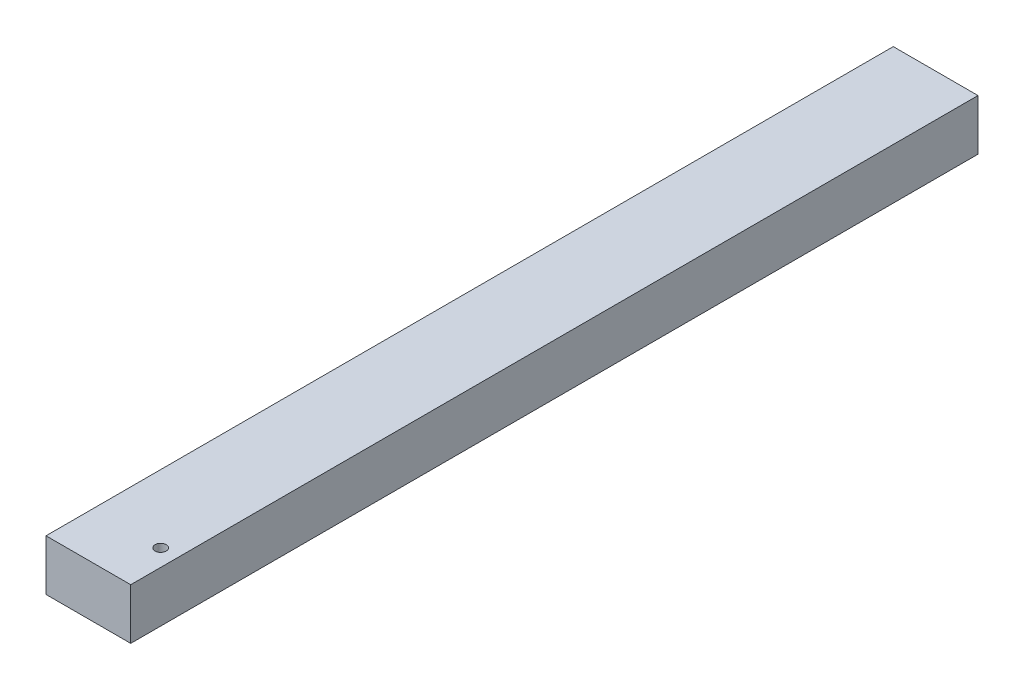
ISO-10303-21;
HEADER;
FILE_DESCRIPTION(('STEP AP214'),'2;1');
FILE_NAME('part.step','',(''),(''),'','','');
FILE_SCHEMA(('AUTOMOTIVE_DESIGN { 1 0 10303 214 1 1 1 1 }'));
ENDSEC;
DATA;
#1=APPLICATION_CONTEXT('core data for automotive mechanical design processes');
#2=APPLICATION_PROTOCOL_DEFINITION('international standard','automotive_design',2000,#1);
#3=PRODUCT_CONTEXT('',#1,'mechanical');
#4=PRODUCT('Part','Part','',(#3));
#5=PRODUCT_RELATED_PRODUCT_CATEGORY('part','',(#4));
#6=PRODUCT_DEFINITION_FORMATION('','',#4);
#7=PRODUCT_DEFINITION_CONTEXT('part definition',#1,'design');
#8=PRODUCT_DEFINITION('design','',#6,#7);
#9=PRODUCT_DEFINITION_SHAPE('','',#8);
#10=(LENGTH_UNIT() NAMED_UNIT(*) SI_UNIT(.MILLI.,.METRE.));
#11=(NAMED_UNIT(*) PLANE_ANGLE_UNIT() SI_UNIT($,.RADIAN.));
#12=(NAMED_UNIT(*) SI_UNIT($,.STERADIAN.) SOLID_ANGLE_UNIT());
#13=UNCERTAINTY_MEASURE_WITH_UNIT(LENGTH_MEASURE(1.E-05),#10,'distance_accuracy_value','');
#14=(GEOMETRIC_REPRESENTATION_CONTEXT(3) GLOBAL_UNCERTAINTY_ASSIGNED_CONTEXT((#13)) GLOBAL_UNIT_ASSIGNED_CONTEXT((#10,
#11,#12)) REPRESENTATION_CONTEXT('',''));
#15=CARTESIAN_POINT('',(0.,0.,0.));
#16=DIRECTION('',(0.,0.,1.));
#17=DIRECTION('',(1.,0.,0.));
#18=AXIS2_PLACEMENT_3D('',#15,#16,#17);
#19=CARTESIAN_POINT('',(0.,0.,500.));
#20=DIRECTION('',(-1.,0.,0.));
#21=DIRECTION('',(0.,0.,1.));
#22=AXIS2_PLACEMENT_3D('',#19,#20,#21);
#23=PLANE('',#22);
#24=DIRECTION('',(0.,1.,0.));
#25=VECTOR('',#24,1.);
#26=CARTESIAN_POINT('',(0.,0.,0.));
#27=LINE('',#26,#25);
#28=CARTESIAN_POINT('',(0.,0.,0.));
#29=VERTEX_POINT('',#28);
#30=CARTESIAN_POINT('',(0.,30.,0.));
#31=VERTEX_POINT('',#30);
#32=EDGE_CURVE('E96',#29,#31,#27,.T.);
#33=ORIENTED_EDGE('',*,*,#32,.T.);
#34=DIRECTION('',(0.,0.,-1.));
#35=VECTOR('',#34,1.);
#36=CARTESIAN_POINT('',(0.,30.,500.));
#37=LINE('',#36,#35);
#38=CARTESIAN_POINT('',(0.,30.,500.));
#39=VERTEX_POINT('',#38);
#40=EDGE_CURVE('E11',#39,#31,#37,.T.);
#41=ORIENTED_EDGE('',*,*,#40,.F.);
#42=DIRECTION('',(0.,1.,0.));
#43=VECTOR('',#42,1.);
#44=CARTESIAN_POINT('',(0.,0.,500.));
#45=LINE('',#44,#43);
#46=CARTESIAN_POINT('',(0.,0.,500.));
#47=VERTEX_POINT('',#46);
#48=EDGE_CURVE('E84',#47,#39,#45,.T.);
#49=ORIENTED_EDGE('',*,*,#48,.F.);
#50=DIRECTION('',(0.,0.,-1.));
#51=VECTOR('',#50,1.);
#52=CARTESIAN_POINT('',(0.,0.,500.));
#53=LINE('',#52,#51);
#54=EDGE_CURVE('E92',#47,#29,#53,.T.);
#55=ORIENTED_EDGE('',*,*,#54,.T.);
#56=EDGE_LOOP('',(#33,#41,#49,#55));
#57=FACE_BOUND('',#56,.T.);
#58=ADVANCED_FACE('F33',(#57),#23,.F.);
#59=CARTESIAN_POINT('',(0.,30.,500.));
#60=DIRECTION('',(0.,-1.,0.));
#61=DIRECTION('',(1.,0.,0.));
#62=AXIS2_PLACEMENT_3D('',#59,#60,#61);
#63=PLANE('',#62);
#64=CARTESIAN_POINT('',(-9.99999999999994,30.,472.328033339325));
#65=DIRECTION('',(0.,1.,0.));
#66=DIRECTION('',(0.,0.,1.));
#67=AXIS2_PLACEMENT_3D('',#64,#65,#66);
#68=CIRCLE('',#67,3.3);
#69=CARTESIAN_POINT('',(-9.99999999999994,30.,475.628033339325));
#70=VERTEX_POINT('',#69);
#71=EDGE_CURVE('E112',#70,#70,#68,.T.);
#72=ORIENTED_EDGE('',*,*,#71,.F.);
#73=EDGE_LOOP('',(#72));
#74=FACE_BOUND('',#73,.T.);
#75=DIRECTION('',(-1.,0.,0.));
#76=VECTOR('',#75,1.);
#77=CARTESIAN_POINT('',(0.,30.,0.));
#78=LINE('',#77,#76);
#79=CARTESIAN_POINT('',(-50.,30.,0.));
#80=VERTEX_POINT('',#79);
#81=EDGE_CURVE('E88',#31,#80,#78,.T.);
#82=ORIENTED_EDGE('',*,*,#81,.T.);
#83=DIRECTION('',(0.,0.,-1.));
#84=VECTOR('',#83,1.);
#85=CARTESIAN_POINT('',(-50.,30.,500.));
#86=LINE('',#85,#84);
#87=CARTESIAN_POINT('',(-50.,30.,500.));
#88=VERTEX_POINT('',#87);
#89=EDGE_CURVE('E41',#88,#80,#86,.T.);
#90=ORIENTED_EDGE('',*,*,#89,.F.);
#91=DIRECTION('',(-1.,0.,0.));
#92=VECTOR('',#91,1.);
#93=CARTESIAN_POINT('',(0.,30.,500.));
#94=LINE('',#93,#92);
#95=EDGE_CURVE('E79',#39,#88,#94,.T.);
#96=ORIENTED_EDGE('',*,*,#95,.F.);
#97=ORIENTED_EDGE('',*,*,#40,.T.);
#98=EDGE_LOOP('',(#82,#90,#96,#97));
#99=FACE_BOUND('',#98,.T.);
#100=ADVANCED_FACE('F87',(#74,#99),#63,.F.);
#101=CARTESIAN_POINT('',(-50.,0.,500.));
#102=DIRECTION('',(1.,0.,0.));
#103=DIRECTION('',(0.,0.,-1.));
#104=AXIS2_PLACEMENT_3D('',#101,#102,#103);
#105=PLANE('',#104);
#106=DIRECTION('',(0.,-1.,0.));
#107=VECTOR('',#106,1.);
#108=CARTESIAN_POINT('',(-50.,0.,0.));
#109=LINE('',#108,#107);
#110=CARTESIAN_POINT('',(-50.,0.,0.));
#111=VERTEX_POINT('',#110);
#112=EDGE_CURVE('E66',#80,#111,#109,.T.);
#113=ORIENTED_EDGE('',*,*,#112,.T.);
#114=DIRECTION('',(0.,0.,-1.));
#115=VECTOR('',#114,1.);
#116=CARTESIAN_POINT('',(-50.,0.,500.));
#117=LINE('',#116,#115);
#118=CARTESIAN_POINT('',(-50.,0.,500.));
#119=VERTEX_POINT('',#118);
#120=EDGE_CURVE('E89',#119,#111,#117,.T.);
#121=ORIENTED_EDGE('',*,*,#120,.F.);
#122=DIRECTION('',(0.,-1.,0.));
#123=VECTOR('',#122,1.);
#124=CARTESIAN_POINT('',(-50.,0.,500.));
#125=LINE('',#124,#123);
#126=EDGE_CURVE('E82',#88,#119,#125,.T.);
#127=ORIENTED_EDGE('',*,*,#126,.F.);
#128=ORIENTED_EDGE('',*,*,#89,.T.);
#129=EDGE_LOOP('',(#113,#121,#127,#128));
#130=FACE_BOUND('',#129,.T.);
#131=ADVANCED_FACE('F90',(#130),#105,.F.);
#132=CARTESIAN_POINT('',(0.,0.,500.));
#133=DIRECTION('',(0.,1.,0.));
#134=DIRECTION('',(0.,0.,1.));
#135=AXIS2_PLACEMENT_3D('',#132,#133,#134);
#136=PLANE('',#135);
#137=CARTESIAN_POINT('',(-9.99999999999994,0.,472.328033339325));
#138=DIRECTION('',(0.,1.,0.));
#139=DIRECTION('',(0.,0.,1.));
#140=AXIS2_PLACEMENT_3D('',#137,#138,#139);
#141=CIRCLE('',#140,3.29999999999999);
#142=CARTESIAN_POINT('',(-9.99999999999994,0.,475.628033339325));
#143=VERTEX_POINT('',#142);
#144=EDGE_CURVE('E99',#143,#143,#141,.T.);
#145=ORIENTED_EDGE('',*,*,#144,.T.);
#146=EDGE_LOOP('',(#145));
#147=FACE_BOUND('',#146,.T.);
#148=DIRECTION('',(1.,0.,0.));
#149=VECTOR('',#148,1.);
#150=CARTESIAN_POINT('',(0.,0.,0.));
#151=LINE('',#150,#149);
#152=EDGE_CURVE('E72',#111,#29,#151,.T.);
#153=ORIENTED_EDGE('',*,*,#152,.T.);
#154=ORIENTED_EDGE('',*,*,#54,.F.);
#155=DIRECTION('',(1.,0.,0.));
#156=VECTOR('',#155,1.);
#157=CARTESIAN_POINT('',(0.,0.,500.));
#158=LINE('',#157,#156);
#159=EDGE_CURVE('E49',#119,#47,#158,.T.);
#160=ORIENTED_EDGE('',*,*,#159,.F.);
#161=ORIENTED_EDGE('',*,*,#120,.T.);
#162=EDGE_LOOP('',(#153,#154,#160,#161));
#163=FACE_BOUND('',#162,.T.);
#164=ADVANCED_FACE('F104',(#147,#163),#136,.F.);
#165=CARTESIAN_POINT('',(0.,0.,500.));
#166=DIRECTION('',(0.,0.,1.));
#167=DIRECTION('',(1.,0.,0.));
#168=AXIS2_PLACEMENT_3D('',#165,#166,#167);
#169=PLANE('',#168);
#170=ORIENTED_EDGE('',*,*,#48,.T.);
#171=ORIENTED_EDGE('',*,*,#95,.T.);
#172=ORIENTED_EDGE('',*,*,#126,.T.);
#173=ORIENTED_EDGE('',*,*,#159,.T.);
#174=EDGE_LOOP('',(#170,#171,#172,#173));
#175=FACE_BOUND('',#174,.T.);
#176=ADVANCED_FACE('F80',(#175),#169,.T.);
#177=CARTESIAN_POINT('',(0.,0.,0.));
#178=DIRECTION('',(0.,0.,1.));
#179=DIRECTION('',(1.,0.,0.));
#180=AXIS2_PLACEMENT_3D('',#177,#178,#179);
#181=PLANE('',#180);
#182=ORIENTED_EDGE('',*,*,#32,.F.);
#183=ORIENTED_EDGE('',*,*,#152,.F.);
#184=ORIENTED_EDGE('',*,*,#112,.F.);
#185=ORIENTED_EDGE('',*,*,#81,.F.);
#186=EDGE_LOOP('',(#182,#183,#184,#185));
#187=FACE_BOUND('',#186,.T.);
#188=ADVANCED_FACE('F107',(#187),#181,.F.);
#189=CARTESIAN_POINT('',(-9.99999999999994,30.,472.328033339325));
#190=DIRECTION('',(0.,1.,0.));
#191=DIRECTION('',(0.,0.,1.));
#192=AXIS2_PLACEMENT_3D('',#189,#190,#191);
#193=CYLINDRICAL_SURFACE('',#192,3.3);
#194=ORIENTED_EDGE('',*,*,#144,.F.);
#195=EDGE_LOOP('',(#194));
#196=FACE_BOUND('',#195,.T.);
#197=ORIENTED_EDGE('',*,*,#71,.T.);
#198=EDGE_LOOP('',(#197));
#199=FACE_BOUND('',#198,.T.);
#200=ADVANCED_FACE('F116',(#196,#199),#193,.F.);
#201=CLOSED_SHELL('',(#58,#100,#131,#164,#176,#188,#200));
#202=MANIFOLD_SOLID_BREP('B2',#201);
#203=ADVANCED_BREP_SHAPE_REPRESENTATION('',(#18,#202),#14);
#204=SHAPE_DEFINITION_REPRESENTATION(#9,#203);
ENDSEC;
END-ISO-10303-21;
